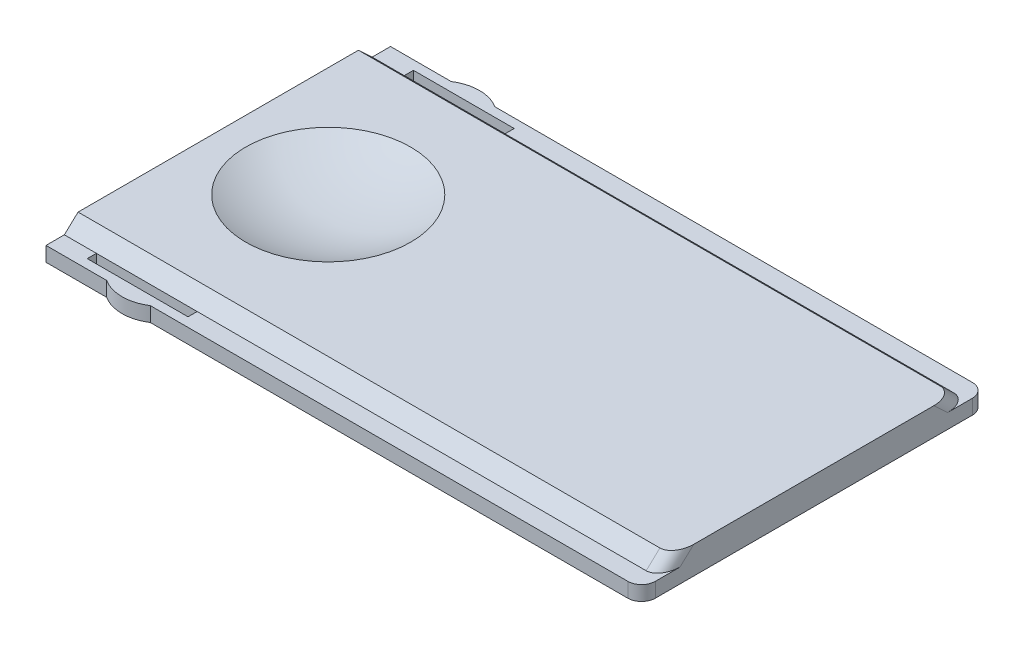
ISO-10303-21;
HEADER;
FILE_DESCRIPTION(('STEP AP214'),'2;1');
FILE_NAME('part.step','',(''),(''),'','','');
FILE_SCHEMA(('AUTOMOTIVE_DESIGN { 1 0 10303 214 1 1 1 1 }'));
ENDSEC;
DATA;
#1=APPLICATION_CONTEXT('core data for automotive mechanical design processes');
#2=APPLICATION_PROTOCOL_DEFINITION('international standard','automotive_design',2000,#1);
#3=PRODUCT_CONTEXT('',#1,'mechanical');
#4=PRODUCT('Part','Part','',(#3));
#5=PRODUCT_RELATED_PRODUCT_CATEGORY('part','',(#4));
#6=PRODUCT_DEFINITION_FORMATION('','',#4);
#7=PRODUCT_DEFINITION_CONTEXT('part definition',#1,'design');
#8=PRODUCT_DEFINITION('design','',#6,#7);
#9=PRODUCT_DEFINITION_SHAPE('','',#8);
#10=(LENGTH_UNIT() NAMED_UNIT(*) SI_UNIT(.MILLI.,.METRE.));
#11=(NAMED_UNIT(*) PLANE_ANGLE_UNIT() SI_UNIT($,.RADIAN.));
#12=(NAMED_UNIT(*) SI_UNIT($,.STERADIAN.) SOLID_ANGLE_UNIT());
#13=UNCERTAINTY_MEASURE_WITH_UNIT(LENGTH_MEASURE(1.E-05),#10,'distance_accuracy_value','');
#14=(GEOMETRIC_REPRESENTATION_CONTEXT(3) GLOBAL_UNCERTAINTY_ASSIGNED_CONTEXT((#13)) GLOBAL_UNIT_ASSIGNED_CONTEXT((#10,
#11,#12)) REPRESENTATION_CONTEXT('',''));
#15=CARTESIAN_POINT('',(0.,0.,0.));
#16=DIRECTION('',(0.,0.,1.));
#17=DIRECTION('',(1.,0.,0.));
#18=AXIS2_PLACEMENT_3D('',#15,#16,#17);
#19=CARTESIAN_POINT('',(65.,0.,18.8));
#20=DIRECTION('',(0.,0.,-1.));
#21=DIRECTION('',(-1.,0.,0.));
#22=AXIS2_PLACEMENT_3D('',#19,#20,#21);
#23=PLANE('',#22);
#24=DIRECTION('',(-1.,0.,0.));
#25=VECTOR('',#24,1.);
#26=CARTESIAN_POINT('',(65.,0.,18.8));
#27=LINE('',#26,#25);
#28=CARTESIAN_POINT('',(6.61882382004187,0.,18.8));
#29=VERTEX_POINT('',#28);
#30=CARTESIAN_POINT('',(0.,0.,18.8));
#31=VERTEX_POINT('',#30);
#32=EDGE_CURVE('E350',#29,#31,#27,.T.);
#33=ORIENTED_EDGE('',*,*,#32,.F.);
#34=DIRECTION('',(0.,1.,0.));
#35=VECTOR('',#34,1.);
#36=CARTESIAN_POINT('',(6.61882382004188,-12.4450793488832,18.8));
#37=LINE('',#36,#35);
#38=CARTESIAN_POINT('',(6.61882382004187,1.59999999999999,18.8));
#39=VERTEX_POINT('',#38);
#40=EDGE_CURVE('E281',#29,#39,#37,.T.);
#41=ORIENTED_EDGE('',*,*,#40,.T.);
#42=DIRECTION('',(-1.,0.,0.));
#43=VECTOR('',#42,1.);
#44=CARTESIAN_POINT('',(65.,1.6,18.8));
#45=LINE('',#44,#43);
#46=CARTESIAN_POINT('',(0.,1.6,18.8));
#47=VERTEX_POINT('',#46);
#48=EDGE_CURVE('E309',#39,#47,#45,.T.);
#49=ORIENTED_EDGE('',*,*,#48,.T.);
#50=DIRECTION('',(0.,-1.,0.));
#51=VECTOR('',#50,1.);
#52=CARTESIAN_POINT('',(0.,0.,18.8));
#53=LINE('',#52,#51);
#54=EDGE_CURVE('E296',#47,#31,#53,.T.);
#55=ORIENTED_EDGE('',*,*,#54,.T.);
#56=EDGE_LOOP('',(#33,#41,#49,#55));
#57=FACE_BOUND('',#56,.T.);
#58=ADVANCED_FACE('F33',(#57),#23,.F.);
#59=CARTESIAN_POINT('',(65.,0.,-18.8));
#60=DIRECTION('',(0.,0.,1.));
#61=DIRECTION('',(1.,0.,0.));
#62=AXIS2_PLACEMENT_3D('',#59,#60,#61);
#63=PLANE('',#62);
#64=DIRECTION('',(-1.,0.,0.));
#65=VECTOR('',#64,1.);
#66=CARTESIAN_POINT('',(65.,1.6,-18.8));
#67=LINE('',#66,#65);
#68=CARTESIAN_POINT('',(63.5,1.6,-18.8));
#69=VERTEX_POINT('',#68);
#70=CARTESIAN_POINT('',(11.3811761799581,1.6,-18.8));
#71=VERTEX_POINT('',#70);
#72=EDGE_CURVE('E345',#69,#71,#67,.T.);
#73=ORIENTED_EDGE('',*,*,#72,.F.);
#74=DIRECTION('',(0.,1.,0.));
#75=VECTOR('',#74,1.);
#76=CARTESIAN_POINT('',(63.5,0.,-18.8));
#77=LINE('',#76,#75);
#78=CARTESIAN_POINT('',(63.5,0.,-18.8));
#79=VERTEX_POINT('',#78);
#80=EDGE_CURVE('E383',#69,#79,#77,.F.);
#81=ORIENTED_EDGE('',*,*,#80,.T.);
#82=DIRECTION('',(-1.,0.,0.));
#83=VECTOR('',#82,1.);
#84=CARTESIAN_POINT('',(65.,0.,-18.8));
#85=LINE('',#84,#83);
#86=CARTESIAN_POINT('',(11.3811761799581,0.,-18.8));
#87=VERTEX_POINT('',#86);
#88=EDGE_CURVE('E348',#79,#87,#85,.T.);
#89=ORIENTED_EDGE('',*,*,#88,.T.);
#90=DIRECTION('',(0.,1.,0.));
#91=VECTOR('',#90,1.);
#92=CARTESIAN_POINT('',(11.3811761799581,-12.4450793488832,-18.8));
#93=LINE('',#92,#91);
#94=EDGE_CURVE('E293',#87,#71,#93,.T.);
#95=ORIENTED_EDGE('',*,*,#94,.T.);
#96=EDGE_LOOP('',(#73,#81,#89,#95));
#97=FACE_BOUND('',#96,.T.);
#98=ADVANCED_FACE('F436',(#97),#63,.F.);
#99=CARTESIAN_POINT('',(63.5,0.,18.8));
#100=VERTEX_POINT('',#99);
#101=CARTESIAN_POINT('',(11.3811761799581,0.,18.8));
#102=VERTEX_POINT('',#101);
#103=EDGE_CURVE('E351',#100,#102,#27,.T.);
#104=ORIENTED_EDGE('',*,*,#103,.F.);
#105=DIRECTION('',(0.,-1.,0.));
#106=VECTOR('',#105,1.);
#107=CARTESIAN_POINT('',(63.5,0.,18.8));
#108=LINE('',#107,#106);
#109=CARTESIAN_POINT('',(63.5,1.6,18.8));
#110=VERTEX_POINT('',#109);
#111=EDGE_CURVE('E371',#100,#110,#108,.F.);
#112=ORIENTED_EDGE('',*,*,#111,.T.);
#113=CARTESIAN_POINT('',(11.3811761799581,1.59999999999999,18.8));
#114=VERTEX_POINT('',#113);
#115=EDGE_CURVE('E332',#110,#114,#45,.T.);
#116=ORIENTED_EDGE('',*,*,#115,.T.);
#117=DIRECTION('',(0.,1.,0.));
#118=VECTOR('',#117,1.);
#119=CARTESIAN_POINT('',(11.3811761799581,-12.4450793488832,18.8));
#120=LINE('',#119,#118);
#121=EDGE_CURVE('E278',#114,#102,#120,.F.);
#122=ORIENTED_EDGE('',*,*,#121,.T.);
#123=EDGE_LOOP('',(#104,#112,#116,#122));
#124=FACE_BOUND('',#123,.T.);
#125=ADVANCED_FACE('F439',(#124),#23,.F.);
#126=CARTESIAN_POINT('',(65.,0.,-18.8));
#127=DIRECTION('',(0.,1.,0.));
#128=DIRECTION('',(0.,0.,1.));
#129=AXIS2_PLACEMENT_3D('',#126,#127,#128);
#130=PLANE('',#129);
#131=DIRECTION('',(-1.,0.,0.));
#132=VECTOR('',#131,1.);
#133=CARTESIAN_POINT('',(3.49999999999999,0.,16.8));
#134=LINE('',#133,#132);
#135=CARTESIAN_POINT('',(14.5,0.,16.8));
#136=VERTEX_POINT('',#135);
#137=CARTESIAN_POINT('',(3.49999999999999,0.,16.8));
#138=VERTEX_POINT('',#137);
#139=EDGE_CURVE('E207',#136,#138,#134,.T.);
#140=ORIENTED_EDGE('',*,*,#139,.T.);
#141=DIRECTION('',(0.,0.,1.));
#142=VECTOR('',#141,1.);
#143=CARTESIAN_POINT('',(3.49999999999999,0.,17.8));
#144=LINE('',#143,#142);
#145=CARTESIAN_POINT('',(3.49999999999999,0.,17.8));
#146=VERTEX_POINT('',#145);
#147=EDGE_CURVE('E199',#138,#146,#144,.T.);
#148=ORIENTED_EDGE('',*,*,#147,.T.);
#149=DIRECTION('',(1.,0.,0.));
#150=VECTOR('',#149,1.);
#151=CARTESIAN_POINT('',(3.49999999999999,0.,17.8));
#152=LINE('',#151,#150);
#153=CARTESIAN_POINT('',(14.5,0.,17.8));
#154=VERTEX_POINT('',#153);
#155=EDGE_CURVE('E211',#146,#154,#152,.T.);
#156=ORIENTED_EDGE('',*,*,#155,.T.);
#157=DIRECTION('',(0.,0.,-1.));
#158=VECTOR('',#157,1.);
#159=CARTESIAN_POINT('',(14.5,0.,17.8));
#160=LINE('',#159,#158);
#161=EDGE_CURVE('E215',#154,#136,#160,.T.);
#162=ORIENTED_EDGE('',*,*,#161,.T.);
#163=EDGE_LOOP('',(#140,#148,#156,#162));
#164=FACE_BOUND('',#163,.T.);
#165=DIRECTION('',(1.,0.,0.));
#166=VECTOR('',#165,1.);
#167=CARTESIAN_POINT('',(3.49999999999999,0.,-16.8));
#168=LINE('',#167,#166);
#169=CARTESIAN_POINT('',(3.49999999999999,0.,-16.8));
#170=VERTEX_POINT('',#169);
#171=CARTESIAN_POINT('',(14.5,0.,-16.8));
#172=VERTEX_POINT('',#171);
#173=EDGE_CURVE('E251',#170,#172,#168,.T.);
#174=ORIENTED_EDGE('',*,*,#173,.T.);
#175=DIRECTION('',(0.,0.,-1.));
#176=VECTOR('',#175,1.);
#177=CARTESIAN_POINT('',(14.5,0.,-17.8));
#178=LINE('',#177,#176);
#179=CARTESIAN_POINT('',(14.5,0.,-17.8));
#180=VERTEX_POINT('',#179);
#181=EDGE_CURVE('E241',#172,#180,#178,.T.);
#182=ORIENTED_EDGE('',*,*,#181,.T.);
#183=DIRECTION('',(-1.,0.,0.));
#184=VECTOR('',#183,1.);
#185=CARTESIAN_POINT('',(3.49999999999999,0.,-17.8));
#186=LINE('',#185,#184);
#187=CARTESIAN_POINT('',(3.5,0.,-17.8));
#188=VERTEX_POINT('',#187);
#189=EDGE_CURVE('E244',#180,#188,#186,.T.);
#190=ORIENTED_EDGE('',*,*,#189,.T.);
#191=DIRECTION('',(0.,0.,1.));
#192=VECTOR('',#191,1.);
#193=CARTESIAN_POINT('',(3.49999999999999,0.,-17.8));
#194=LINE('',#193,#192);
#195=EDGE_CURVE('E248',#188,#170,#194,.T.);
#196=ORIENTED_EDGE('',*,*,#195,.T.);
#197=EDGE_LOOP('',(#174,#182,#190,#196));
#198=FACE_BOUND('',#197,.T.);
#199=DIRECTION('',(0.,0.,-1.));
#200=VECTOR('',#199,1.);
#201=CARTESIAN_POINT('',(65.,0.,-18.8));
#202=LINE('',#201,#200);
#203=CARTESIAN_POINT('',(65.,0.,17.3));
#204=VERTEX_POINT('',#203);
#205=CARTESIAN_POINT('',(65.,0.,-17.3));
#206=VERTEX_POINT('',#205);
#207=EDGE_CURVE('E297',#204,#206,#202,.T.);
#208=ORIENTED_EDGE('',*,*,#207,.F.);
#209=CARTESIAN_POINT('',(63.5,0.,17.3));
#210=DIRECTION('',(0.,1.,0.));
#211=DIRECTION('',(0.,0.,1.));
#212=AXIS2_PLACEMENT_3D('',#209,#210,#211);
#213=CIRCLE('',#212,1.5);
#214=EDGE_CURVE('E369',#204,#100,#213,.F.);
#215=ORIENTED_EDGE('',*,*,#214,.T.);
#216=ORIENTED_EDGE('',*,*,#103,.T.);
#217=CARTESIAN_POINT('',(9.,0.,15.1));
#218=DIRECTION('',(0.,1.,0.));
#219=DIRECTION('',(0.,0.,1.));
#220=AXIS2_PLACEMENT_3D('',#217,#218,#219);
#221=CIRCLE('',#220,4.4);
#222=EDGE_CURVE('E276',#102,#29,#221,.F.);
#223=ORIENTED_EDGE('',*,*,#222,.T.);
#224=ORIENTED_EDGE('',*,*,#32,.T.);
#225=DIRECTION('',(0.,0.,-1.));
#226=VECTOR('',#225,1.);
#227=CARTESIAN_POINT('',(0.,0.,-18.8));
#228=LINE('',#227,#226);
#229=CARTESIAN_POINT('',(0.,0.,-18.8));
#230=VERTEX_POINT('',#229);
#231=EDGE_CURVE('E312',#31,#230,#228,.T.);
#232=ORIENTED_EDGE('',*,*,#231,.T.);
#233=CARTESIAN_POINT('',(6.61882382004187,0.,-18.8));
#234=VERTEX_POINT('',#233);
#235=EDGE_CURVE('E347',#234,#230,#85,.T.);
#236=ORIENTED_EDGE('',*,*,#235,.F.);
#237=CARTESIAN_POINT('',(9.,0.,-15.1));
#238=DIRECTION('',(0.,1.,0.));
#239=DIRECTION('',(0.,0.,1.));
#240=AXIS2_PLACEMENT_3D('',#237,#238,#239);
#241=CIRCLE('',#240,4.4);
#242=EDGE_CURVE('E287',#234,#87,#241,.F.);
#243=ORIENTED_EDGE('',*,*,#242,.T.);
#244=ORIENTED_EDGE('',*,*,#88,.F.);
#245=CARTESIAN_POINT('',(63.5,0.,-17.3));
#246=DIRECTION('',(0.,1.,0.));
#247=DIRECTION('',(0.,0.,1.));
#248=AXIS2_PLACEMENT_3D('',#245,#246,#247);
#249=CIRCLE('',#248,1.5);
#250=EDGE_CURVE('E367',#79,#206,#249,.F.);
#251=ORIENTED_EDGE('',*,*,#250,.T.);
#252=EDGE_LOOP('',(#208,#215,#216,#223,#224,#232,#236,#243,#244,#251));
#253=FACE_BOUND('',#252,.T.);
#254=ADVANCED_FACE('F217',(#164,#198,#253),#130,.F.);
#255=CARTESIAN_POINT('',(6.61882382004187,1.6,-18.8));
#256=VERTEX_POINT('',#255);
#257=CARTESIAN_POINT('',(0.,1.6,-18.8));
#258=VERTEX_POINT('',#257);
#259=EDGE_CURVE('E344',#256,#258,#67,.T.);
#260=ORIENTED_EDGE('',*,*,#259,.F.);
#261=DIRECTION('',(0.,1.,0.));
#262=VECTOR('',#261,1.);
#263=CARTESIAN_POINT('',(6.61882382004187,-12.4450793488832,-18.8));
#264=LINE('',#263,#262);
#265=EDGE_CURVE('E290',#256,#234,#264,.F.);
#266=ORIENTED_EDGE('',*,*,#265,.T.);
#267=ORIENTED_EDGE('',*,*,#235,.T.);
#268=DIRECTION('',(0.,1.,0.));
#269=VECTOR('',#268,1.);
#270=CARTESIAN_POINT('',(0.,0.,-18.8));
#271=LINE('',#270,#269);
#272=EDGE_CURVE('E315',#230,#258,#271,.T.);
#273=ORIENTED_EDGE('',*,*,#272,.T.);
#274=EDGE_LOOP('',(#260,#266,#267,#273));
#275=FACE_BOUND('',#274,.T.);
#276=ADVANCED_FACE('F445',(#275),#63,.F.);
#277=CARTESIAN_POINT('',(65.,1.6,-18.8));
#278=DIRECTION('',(0.,-1.,0.));
#279=DIRECTION('',(0.,0.,-1.));
#280=AXIS2_PLACEMENT_3D('',#277,#278,#279);
#281=PLANE('',#280);
#282=DIRECTION('',(0.,0.,1.));
#283=VECTOR('',#282,1.);
#284=CARTESIAN_POINT('',(65.,1.6,-18.8));
#285=LINE('',#284,#283);
#286=CARTESIAN_POINT('',(65.,1.6,-17.3));
#287=VERTEX_POINT('',#286);
#288=CARTESIAN_POINT('',(65.,1.6,-14.6016123719268));
#289=VERTEX_POINT('',#288);
#290=EDGE_CURVE('E300',#287,#289,#285,.T.);
#291=ORIENTED_EDGE('',*,*,#290,.F.);
#292=CARTESIAN_POINT('',(63.5,1.6,-17.3));
#293=DIRECTION('',(0.,-1.,0.));
#294=DIRECTION('',(0.,0.,-1.));
#295=AXIS2_PLACEMENT_3D('',#292,#293,#294);
#296=CIRCLE('',#295,1.5);
#297=EDGE_CURVE('E48',#287,#69,#296,.F.);
#298=ORIENTED_EDGE('',*,*,#297,.T.);
#299=ORIENTED_EDGE('',*,*,#72,.T.);
#300=CARTESIAN_POINT('',(9.,1.6,-15.1));
#301=DIRECTION('',(0.,1.,0.));
#302=DIRECTION('',(0.,0.,1.));
#303=AXIS2_PLACEMENT_3D('',#300,#301,#302);
#304=CIRCLE('',#303,4.4);
#305=EDGE_CURVE('E284',#71,#256,#304,.T.);
#306=ORIENTED_EDGE('',*,*,#305,.T.);
#307=ORIENTED_EDGE('',*,*,#259,.T.);
#308=DIRECTION('',(0.,0.,1.));
#309=VECTOR('',#308,1.);
#310=CARTESIAN_POINT('',(0.,1.6,-18.8));
#311=LINE('',#310,#309);
#312=CARTESIAN_POINT('',(0.,1.6,-16.8));
#313=VERTEX_POINT('',#312);
#314=EDGE_CURVE('E318',#258,#313,#311,.T.);
#315=ORIENTED_EDGE('',*,*,#314,.T.);
#316=DIRECTION('',(-1.,0.,0.));
#317=VECTOR('',#316,1.);
#318=CARTESIAN_POINT('',(65.,1.6,-16.8));
#319=LINE('',#318,#317);
#320=CARTESIAN_POINT('',(3.5,1.6,-16.8));
#321=VERTEX_POINT('',#320);
#322=EDGE_CURVE('E341',#321,#313,#319,.T.);
#323=ORIENTED_EDGE('',*,*,#322,.F.);
#324=DIRECTION('',(0.,0.,1.));
#325=VECTOR('',#324,1.);
#326=CARTESIAN_POINT('',(3.49999999999999,1.6,-17.8));
#327=LINE('',#326,#325);
#328=CARTESIAN_POINT('',(3.49999999999999,1.6,-17.8));
#329=VERTEX_POINT('',#328);
#330=EDGE_CURVE('E260',#329,#321,#327,.T.);
#331=ORIENTED_EDGE('',*,*,#330,.F.);
#332=DIRECTION('',(-1.,0.,0.));
#333=VECTOR('',#332,1.);
#334=CARTESIAN_POINT('',(3.49999999999999,1.6,-17.8));
#335=LINE('',#334,#333);
#336=CARTESIAN_POINT('',(14.5,1.6,-17.8));
#337=VERTEX_POINT('',#336);
#338=EDGE_CURVE('E257',#337,#329,#335,.T.);
#339=ORIENTED_EDGE('',*,*,#338,.F.);
#340=DIRECTION('',(0.,0.,-1.));
#341=VECTOR('',#340,1.);
#342=CARTESIAN_POINT('',(14.5,1.6,-17.8));
#343=LINE('',#342,#341);
#344=CARTESIAN_POINT('',(14.5,1.6,-16.8));
#345=VERTEX_POINT('',#344);
#346=EDGE_CURVE('E236',#345,#337,#343,.T.);
#347=ORIENTED_EDGE('',*,*,#346,.F.);
#348=CARTESIAN_POINT('',(63.5,1.6,-16.8));
#349=VERTEX_POINT('',#348);
#350=EDGE_CURVE('E342',#349,#345,#319,.T.);
#351=ORIENTED_EDGE('',*,*,#350,.F.);
#352=CARTESIAN_POINT('',(63.5,1.6,-14.6016123719268));
#353=DIRECTION('',(0.,-1.,0.));
#354=DIRECTION('',(0.,0.,1.));
#355=AXIS2_PLACEMENT_3D('',#352,#353,#354);
#356=ELLIPSE('',#355,2.1983876280732,1.5);
#357=EDGE_CURVE('E11',#349,#289,#356,.T.);
#358=ORIENTED_EDGE('',*,*,#357,.T.);
#359=EDGE_LOOP('',(#291,#298,#299,#306,#307,#315,#323,#331,#339,#347,#351,#358));
#360=FACE_BOUND('',#359,.T.);
#361=ADVANCED_FACE('F469',(#360),#281,.F.);
#362=CARTESIAN_POINT('',(65.,1.6,-16.8));
#363=DIRECTION('',(0.,-0.731055268242869,0.682318250360011));
#364=DIRECTION('',(0.,-0.682318250360011,-0.731055268242869));
#365=AXIS2_PLACEMENT_3D('',#362,#363,#364);
#366=PLANE('',#365);
#367=DIRECTION('',(-1.,0.,0.));
#368=VECTOR('',#367,1.);
#369=CARTESIAN_POINT('',(65.,3.,-15.3));
#370=LINE('',#369,#368);
#371=CARTESIAN_POINT('',(63.5,3.,-15.3));
#372=VERTEX_POINT('',#371);
#373=CARTESIAN_POINT('',(0.,3.,-15.3));
#374=VERTEX_POINT('',#373);
#375=EDGE_CURVE('E339',#372,#374,#370,.T.);
#376=ORIENTED_EDGE('',*,*,#375,.F.);
#377=DIRECTION('',(0.,0.682318250360011,0.731055268242869));
#378=VECTOR('',#377,1.);
#379=CARTESIAN_POINT('',(63.5,1.6,-16.8));
#380=LINE('',#379,#378);
#381=EDGE_CURVE('E56',#372,#349,#380,.F.);
#382=ORIENTED_EDGE('',*,*,#381,.T.);
#383=ORIENTED_EDGE('',*,*,#350,.T.);
#384=DIRECTION('',(1.,0.,0.));
#385=VECTOR('',#384,1.);
#386=CARTESIAN_POINT('',(3.49999999999999,1.6,-16.8));
#387=LINE('',#386,#385);
#388=EDGE_CURVE('E245',#321,#345,#387,.T.);
#389=ORIENTED_EDGE('',*,*,#388,.F.);
#390=ORIENTED_EDGE('',*,*,#322,.T.);
#391=DIRECTION('',(0.,0.682318250360011,0.731055268242869));
#392=VECTOR('',#391,1.);
#393=CARTESIAN_POINT('',(0.,1.6,-16.8));
#394=LINE('',#393,#392);
#395=EDGE_CURVE('E321',#313,#374,#394,.T.);
#396=ORIENTED_EDGE('',*,*,#395,.T.);
#397=EDGE_LOOP('',(#376,#382,#383,#389,#390,#396));
#398=FACE_BOUND('',#397,.T.);
#399=ADVANCED_FACE('F409',(#398),#366,.F.);
#400=CARTESIAN_POINT('',(65.,3.,15.3));
#401=DIRECTION('',(0.,-1.,0.));
#402=DIRECTION('',(0.,0.,-1.));
#403=AXIS2_PLACEMENT_3D('',#400,#401,#402);
#404=PLANE('',#403);
#405=CARTESIAN_POINT('',(12.,3.,0.));
#406=DIRECTION('',(0.,-1.,0.));
#407=DIRECTION('',(0.,0.,-1.));
#408=AXIS2_PLACEMENT_3D('',#405,#406,#407);
#409=CIRCLE('',#408,9.);
#410=CARTESIAN_POINT('',(12.,3.,-9.));
#411=VERTEX_POINT('',#410);
#412=EDGE_CURVE('E230',#411,#411,#409,.T.);
#413=ORIENTED_EDGE('',*,*,#412,.T.);
#414=EDGE_LOOP('',(#413));
#415=FACE_BOUND('',#414,.T.);
#416=DIRECTION('',(-1.,0.,0.));
#417=VECTOR('',#416,1.);
#418=CARTESIAN_POINT('',(65.,3.,15.3));
#419=LINE('',#418,#417);
#420=CARTESIAN_POINT('',(63.5,3.,15.3));
#421=VERTEX_POINT('',#420);
#422=CARTESIAN_POINT('',(0.,3.,15.3));
#423=VERTEX_POINT('',#422);
#424=EDGE_CURVE('E337',#421,#423,#419,.T.);
#425=ORIENTED_EDGE('',*,*,#424,.F.);
#426=CARTESIAN_POINT('',(63.5,3.,13.1016123719268));
#427=DIRECTION('',(0.,-1.,0.));
#428=DIRECTION('',(0.,0.,1.));
#429=AXIS2_PLACEMENT_3D('',#426,#427,#428);
#430=ELLIPSE('',#429,2.1983876280732,1.5);
#431=CARTESIAN_POINT('',(65.,3.,13.1016123719268));
#432=VERTEX_POINT('',#431);
#433=EDGE_CURVE('E379',#421,#432,#430,.F.);
#434=ORIENTED_EDGE('',*,*,#433,.T.);
#435=DIRECTION('',(0.,0.,1.));
#436=VECTOR('',#435,1.);
#437=CARTESIAN_POINT('',(65.,3.,15.3));
#438=LINE('',#437,#436);
#439=CARTESIAN_POINT('',(65.,3.,-13.1016123719268));
#440=VERTEX_POINT('',#439);
#441=EDGE_CURVE('E303',#440,#432,#438,.T.);
#442=ORIENTED_EDGE('',*,*,#441,.F.);
#443=CARTESIAN_POINT('',(63.5,3.,-13.1016123719268));
#444=DIRECTION('',(0.,-1.,0.));
#445=DIRECTION('',(0.,0.,1.));
#446=AXIS2_PLACEMENT_3D('',#443,#444,#445);
#447=ELLIPSE('',#446,2.1983876280732,1.5);
#448=EDGE_CURVE('E377',#440,#372,#447,.F.);
#449=ORIENTED_EDGE('',*,*,#448,.T.);
#450=ORIENTED_EDGE('',*,*,#375,.T.);
#451=DIRECTION('',(0.,0.,1.));
#452=VECTOR('',#451,1.);
#453=CARTESIAN_POINT('',(0.,3.,15.3));
#454=LINE('',#453,#452);
#455=EDGE_CURVE('E324',#374,#423,#454,.T.);
#456=ORIENTED_EDGE('',*,*,#455,.T.);
#457=EDGE_LOOP('',(#425,#434,#442,#449,#450,#456));
#458=FACE_BOUND('',#457,.T.);
#459=ADVANCED_FACE('F402',(#415,#458),#404,.F.);
#460=CARTESIAN_POINT('',(65.,1.6,16.8));
#461=DIRECTION('',(0.,-0.731055268242869,-0.682318250360011));
#462=DIRECTION('',(0.,0.682318250360011,-0.731055268242869));
#463=AXIS2_PLACEMENT_3D('',#460,#461,#462);
#464=PLANE('',#463);
#465=DIRECTION('',(-1.,0.,0.));
#466=VECTOR('',#465,1.);
#467=CARTESIAN_POINT('',(65.,1.6,16.8));
#468=LINE('',#467,#466);
#469=CARTESIAN_POINT('',(63.5,1.6,16.8));
#470=VERTEX_POINT('',#469);
#471=CARTESIAN_POINT('',(14.5,1.59999999999999,16.8));
#472=VERTEX_POINT('',#471);
#473=EDGE_CURVE('E335',#470,#472,#468,.T.);
#474=ORIENTED_EDGE('',*,*,#473,.F.);
#475=DIRECTION('',(0.,-0.682318250360011,0.731055268242869));
#476=VECTOR('',#475,1.);
#477=CARTESIAN_POINT('',(63.5,1.6,16.8));
#478=LINE('',#477,#476);
#479=EDGE_CURVE('E375',#470,#421,#478,.F.);
#480=ORIENTED_EDGE('',*,*,#479,.T.);
#481=ORIENTED_EDGE('',*,*,#424,.T.);
#482=DIRECTION('',(0.,-0.682318250360011,0.731055268242869));
#483=VECTOR('',#482,1.);
#484=CARTESIAN_POINT('',(0.,1.6,16.8));
#485=LINE('',#484,#483);
#486=CARTESIAN_POINT('',(0.,1.6,16.8));
#487=VERTEX_POINT('',#486);
#488=EDGE_CURVE('E327',#423,#487,#485,.T.);
#489=ORIENTED_EDGE('',*,*,#488,.T.);
#490=CARTESIAN_POINT('',(3.49999999999999,1.59999999999999,16.8));
#491=VERTEX_POINT('',#490);
#492=EDGE_CURVE('E334',#491,#487,#468,.T.);
#493=ORIENTED_EDGE('',*,*,#492,.F.);
#494=DIRECTION('',(-1.,0.,0.));
#495=VECTOR('',#494,1.);
#496=CARTESIAN_POINT('',(3.49999999999999,1.59999999999999,16.8));
#497=LINE('',#496,#495);
#498=EDGE_CURVE('E220',#472,#491,#497,.T.);
#499=ORIENTED_EDGE('',*,*,#498,.F.);
#500=EDGE_LOOP('',(#474,#480,#481,#489,#493,#499));
#501=FACE_BOUND('',#500,.T.);
#502=ADVANCED_FACE('F395',(#501),#464,.F.);
#503=CARTESIAN_POINT('',(65.,1.6,18.8));
#504=DIRECTION('',(0.,-1.,0.));
#505=DIRECTION('',(0.,0.,-1.));
#506=AXIS2_PLACEMENT_3D('',#503,#504,#505);
#507=PLANE('',#506);
#508=ORIENTED_EDGE('',*,*,#115,.F.);
#509=CARTESIAN_POINT('',(63.5,1.6,17.3));
#510=DIRECTION('',(0.,-1.,0.));
#511=DIRECTION('',(0.,0.,-1.));
#512=AXIS2_PLACEMENT_3D('',#509,#510,#511);
#513=CIRCLE('',#512,1.5);
#514=CARTESIAN_POINT('',(65.,1.6,17.3));
#515=VERTEX_POINT('',#514);
#516=EDGE_CURVE('E373',#110,#515,#513,.F.);
#517=ORIENTED_EDGE('',*,*,#516,.T.);
#518=DIRECTION('',(0.,0.,1.));
#519=VECTOR('',#518,1.);
#520=CARTESIAN_POINT('',(65.,1.6,18.8));
#521=LINE('',#520,#519);
#522=CARTESIAN_POINT('',(65.,1.6,14.6016123719268));
#523=VERTEX_POINT('',#522);
#524=EDGE_CURVE('E306',#523,#515,#521,.T.);
#525=ORIENTED_EDGE('',*,*,#524,.F.);
#526=CARTESIAN_POINT('',(63.5,1.6,14.6016123719268));
#527=DIRECTION('',(0.,-1.,0.));
#528=DIRECTION('',(0.,0.,1.));
#529=AXIS2_PLACEMENT_3D('',#526,#527,#528);
#530=ELLIPSE('',#529,2.1983876280732,1.5);
#531=EDGE_CURVE('E41',#523,#470,#530,.T.);
#532=ORIENTED_EDGE('',*,*,#531,.T.);
#533=ORIENTED_EDGE('',*,*,#473,.T.);
#534=DIRECTION('',(0.,0.,-1.));
#535=VECTOR('',#534,1.);
#536=CARTESIAN_POINT('',(14.5,1.59999999999999,17.8));
#537=LINE('',#536,#535);
#538=CARTESIAN_POINT('',(14.5,1.59999999999999,17.8));
#539=VERTEX_POINT('',#538);
#540=EDGE_CURVE('E223',#539,#472,#537,.T.);
#541=ORIENTED_EDGE('',*,*,#540,.F.);
#542=DIRECTION('',(1.,0.,0.));
#543=VECTOR('',#542,1.);
#544=CARTESIAN_POINT('',(3.49999999999999,1.59999999999999,17.8));
#545=LINE('',#544,#543);
#546=CARTESIAN_POINT('',(3.5,1.6,17.8));
#547=VERTEX_POINT('',#546);
#548=EDGE_CURVE('E229',#547,#539,#545,.T.);
#549=ORIENTED_EDGE('',*,*,#548,.F.);
#550=DIRECTION('',(0.,0.,1.));
#551=VECTOR('',#550,1.);
#552=CARTESIAN_POINT('',(3.49999999999999,1.59999999999999,17.8));
#553=LINE('',#552,#551);
#554=EDGE_CURVE('E202',#491,#547,#553,.T.);
#555=ORIENTED_EDGE('',*,*,#554,.F.);
#556=ORIENTED_EDGE('',*,*,#492,.T.);
#557=DIRECTION('',(0.,0.,1.));
#558=VECTOR('',#557,1.);
#559=CARTESIAN_POINT('',(0.,1.6,18.8));
#560=LINE('',#559,#558);
#561=EDGE_CURVE('E301',#487,#47,#560,.T.);
#562=ORIENTED_EDGE('',*,*,#561,.T.);
#563=ORIENTED_EDGE('',*,*,#48,.F.);
#564=CARTESIAN_POINT('',(9.,1.59999999999999,15.1));
#565=DIRECTION('',(0.,1.,0.));
#566=DIRECTION('',(0.,0.,-1.));
#567=AXIS2_PLACEMENT_3D('',#564,#565,#566);
#568=CIRCLE('',#567,4.4);
#569=EDGE_CURVE('E267',#39,#114,#568,.T.);
#570=ORIENTED_EDGE('',*,*,#569,.T.);
#571=EDGE_LOOP('',(#508,#517,#525,#532,#533,#541,#549,#555,#556,#562,#563,#570));
#572=FACE_BOUND('',#571,.T.);
#573=ADVANCED_FACE('F388',(#572),#507,.F.);
#574=CARTESIAN_POINT('',(65.,0.,0.));
#575=DIRECTION('',(-1.,0.,0.));
#576=DIRECTION('',(0.,0.,1.));
#577=AXIS2_PLACEMENT_3D('',#574,#575,#576);
#578=PLANE('',#577);
#579=ORIENTED_EDGE('',*,*,#524,.T.);
#580=DIRECTION('',(0.,-1.,0.));
#581=VECTOR('',#580,1.);
#582=CARTESIAN_POINT('',(65.,0.,17.3));
#583=LINE('',#582,#581);
#584=EDGE_CURVE('E364',#515,#204,#583,.T.);
#585=ORIENTED_EDGE('',*,*,#584,.T.);
#586=ORIENTED_EDGE('',*,*,#207,.T.);
#587=DIRECTION('',(0.,1.,0.));
#588=VECTOR('',#587,1.);
#589=CARTESIAN_POINT('',(65.,0.,-17.3));
#590=LINE('',#589,#588);
#591=EDGE_CURVE('E353',#206,#287,#590,.T.);
#592=ORIENTED_EDGE('',*,*,#591,.T.);
#593=ORIENTED_EDGE('',*,*,#290,.T.);
#594=DIRECTION('',(0.,0.682318250360011,0.731055268242869));
#595=VECTOR('',#594,1.);
#596=CARTESIAN_POINT('',(65.,8.13857149193498,-7.59600005913932));
#597=LINE('',#596,#595);
#598=EDGE_CURVE('E358',#289,#440,#597,.T.);
#599=ORIENTED_EDGE('',*,*,#598,.T.);
#600=ORIENTED_EDGE('',*,*,#441,.T.);
#601=DIRECTION('',(0.,-0.682318250360011,0.731055268242869));
#602=VECTOR('',#601,1.);
#603=CARTESIAN_POINT('',(65.,8.13857149193498,7.59600005913932));
#604=LINE('',#603,#602);
#605=EDGE_CURVE('E361',#432,#523,#604,.T.);
#606=ORIENTED_EDGE('',*,*,#605,.T.);
#607=EDGE_LOOP('',(#579,#585,#586,#592,#593,#599,#600,#606));
#608=FACE_BOUND('',#607,.T.);
#609=ADVANCED_FACE('F404',(#608),#578,.F.);
#610=CARTESIAN_POINT('',(0.,0.,0.));
#611=DIRECTION('',(-1.,0.,0.));
#612=DIRECTION('',(0.,0.,1.));
#613=AXIS2_PLACEMENT_3D('',#610,#611,#612);
#614=PLANE('',#613);
#615=ORIENTED_EDGE('',*,*,#54,.F.);
#616=ORIENTED_EDGE('',*,*,#561,.F.);
#617=ORIENTED_EDGE('',*,*,#488,.F.);
#618=ORIENTED_EDGE('',*,*,#455,.F.);
#619=ORIENTED_EDGE('',*,*,#395,.F.);
#620=ORIENTED_EDGE('',*,*,#314,.F.);
#621=ORIENTED_EDGE('',*,*,#272,.F.);
#622=ORIENTED_EDGE('',*,*,#231,.F.);
#623=EDGE_LOOP('',(#615,#616,#617,#618,#619,#620,#621,#622));
#624=FACE_BOUND('',#623,.T.);
#625=ADVANCED_FACE('F418',(#624),#614,.T.);
#626=CARTESIAN_POINT('',(9.,-12.4450793488832,-15.1));
#627=DIRECTION('',(0.,1.,0.));
#628=DIRECTION('',(0.,0.,1.));
#629=AXIS2_PLACEMENT_3D('',#626,#627,#628);
#630=CYLINDRICAL_SURFACE('',#629,4.4);
#631=ORIENTED_EDGE('',*,*,#94,.F.);
#632=ORIENTED_EDGE('',*,*,#242,.F.);
#633=ORIENTED_EDGE('',*,*,#265,.F.);
#634=ORIENTED_EDGE('',*,*,#305,.F.);
#635=EDGE_LOOP('',(#631,#632,#633,#634));
#636=FACE_BOUND('',#635,.T.);
#637=ADVANCED_FACE('F489',(#636),#630,.T.);
#638=CARTESIAN_POINT('',(9.,-12.4450793488832,15.1));
#639=DIRECTION('',(0.,1.,0.));
#640=DIRECTION('',(0.,0.,1.));
#641=AXIS2_PLACEMENT_3D('',#638,#639,#640);
#642=CYLINDRICAL_SURFACE('',#641,4.4);
#643=ORIENTED_EDGE('',*,*,#40,.F.);
#644=ORIENTED_EDGE('',*,*,#222,.F.);
#645=ORIENTED_EDGE('',*,*,#121,.F.);
#646=ORIENTED_EDGE('',*,*,#569,.F.);
#647=EDGE_LOOP('',(#643,#644,#645,#646));
#648=FACE_BOUND('',#647,.T.);
#649=ADVANCED_FACE('F487',(#648),#642,.T.);
#650=CARTESIAN_POINT('',(14.5,0.,-17.8));
#651=DIRECTION('',(1.,0.,0.));
#652=DIRECTION('',(0.,0.,-1.));
#653=AXIS2_PLACEMENT_3D('',#650,#651,#652);
#654=PLANE('',#653);
#655=ORIENTED_EDGE('',*,*,#346,.T.);
#656=DIRECTION('',(0.,1.,0.));
#657=VECTOR('',#656,1.);
#658=CARTESIAN_POINT('',(14.5,0.,-17.8));
#659=LINE('',#658,#657);
#660=EDGE_CURVE('E254',#180,#337,#659,.T.);
#661=ORIENTED_EDGE('',*,*,#660,.F.);
#662=ORIENTED_EDGE('',*,*,#181,.F.);
#663=DIRECTION('',(0.,1.,0.));
#664=VECTOR('',#663,1.);
#665=CARTESIAN_POINT('',(14.5,0.,-16.8));
#666=LINE('',#665,#664);
#667=EDGE_CURVE('E264',#172,#345,#666,.T.);
#668=ORIENTED_EDGE('',*,*,#667,.T.);
#669=EDGE_LOOP('',(#655,#661,#662,#668));
#670=FACE_BOUND('',#669,.T.);
#671=ADVANCED_FACE('F474',(#670),#654,.F.);
#672=CARTESIAN_POINT('',(3.49999999999999,0.,-16.8));
#673=DIRECTION('',(0.,0.,1.));
#674=DIRECTION('',(0.,-1.,0.));
#675=AXIS2_PLACEMENT_3D('',#672,#673,#674);
#676=PLANE('',#675);
#677=ORIENTED_EDGE('',*,*,#388,.T.);
#678=ORIENTED_EDGE('',*,*,#667,.F.);
#679=ORIENTED_EDGE('',*,*,#173,.F.);
#680=DIRECTION('',(0.,1.,0.));
#681=VECTOR('',#680,1.);
#682=CARTESIAN_POINT('',(3.49999999999999,0.,-16.8));
#683=LINE('',#682,#681);
#684=EDGE_CURVE('E268',#170,#321,#683,.T.);
#685=ORIENTED_EDGE('',*,*,#684,.T.);
#686=EDGE_LOOP('',(#677,#678,#679,#685));
#687=FACE_BOUND('',#686,.T.);
#688=ADVANCED_FACE('F477',(#687),#676,.F.);
#689=CARTESIAN_POINT('',(3.49999999999999,0.,-17.8));
#690=DIRECTION('',(-1.,0.,0.));
#691=DIRECTION('',(0.,0.,1.));
#692=AXIS2_PLACEMENT_3D('',#689,#690,#691);
#693=PLANE('',#692);
#694=ORIENTED_EDGE('',*,*,#330,.T.);
#695=ORIENTED_EDGE('',*,*,#684,.F.);
#696=ORIENTED_EDGE('',*,*,#195,.F.);
#697=DIRECTION('',(0.,1.,0.));
#698=VECTOR('',#697,1.);
#699=CARTESIAN_POINT('',(3.49999999999999,0.,-17.8));
#700=LINE('',#699,#698);
#701=EDGE_CURVE('E271',#188,#329,#700,.T.);
#702=ORIENTED_EDGE('',*,*,#701,.T.);
#703=EDGE_LOOP('',(#694,#695,#696,#702));
#704=FACE_BOUND('',#703,.T.);
#705=ADVANCED_FACE('F571',(#704),#693,.F.);
#706=CARTESIAN_POINT('',(3.49999999999999,0.,-17.8));
#707=DIRECTION('',(0.,0.,-1.));
#708=DIRECTION('',(0.,1.,0.));
#709=AXIS2_PLACEMENT_3D('',#706,#707,#708);
#710=PLANE('',#709);
#711=ORIENTED_EDGE('',*,*,#338,.T.);
#712=ORIENTED_EDGE('',*,*,#701,.F.);
#713=ORIENTED_EDGE('',*,*,#189,.F.);
#714=ORIENTED_EDGE('',*,*,#660,.T.);
#715=EDGE_LOOP('',(#711,#712,#713,#714));
#716=FACE_BOUND('',#715,.T.);
#717=ADVANCED_FACE('F432',(#716),#710,.F.);
#718=CARTESIAN_POINT('',(3.49999999999999,0.,17.8));
#719=DIRECTION('',(-1.,0.,0.));
#720=DIRECTION('',(0.,0.,1.));
#721=AXIS2_PLACEMENT_3D('',#718,#719,#720);
#722=PLANE('',#721);
#723=ORIENTED_EDGE('',*,*,#554,.T.);
#724=DIRECTION('',(0.,1.,0.));
#725=VECTOR('',#724,1.);
#726=CARTESIAN_POINT('',(3.49999999999999,0.,17.8));
#727=LINE('',#726,#725);
#728=EDGE_CURVE('E195',#146,#547,#727,.T.);
#729=ORIENTED_EDGE('',*,*,#728,.F.);
#730=ORIENTED_EDGE('',*,*,#147,.F.);
#731=DIRECTION('',(0.,1.,0.));
#732=VECTOR('',#731,1.);
#733=CARTESIAN_POINT('',(3.49999999999999,0.,16.8));
#734=LINE('',#733,#732);
#735=EDGE_CURVE('E234',#138,#491,#734,.T.);
#736=ORIENTED_EDGE('',*,*,#735,.T.);
#737=EDGE_LOOP('',(#723,#729,#730,#736));
#738=FACE_BOUND('',#737,.T.);
#739=ADVANCED_FACE('F197',(#738),#722,.F.);
#740=CARTESIAN_POINT('',(3.49999999999999,0.,16.8));
#741=DIRECTION('',(0.,0.,-1.));
#742=DIRECTION('',(0.,1.,0.));
#743=AXIS2_PLACEMENT_3D('',#740,#741,#742);
#744=PLANE('',#743);
#745=ORIENTED_EDGE('',*,*,#498,.T.);
#746=ORIENTED_EDGE('',*,*,#735,.F.);
#747=ORIENTED_EDGE('',*,*,#139,.F.);
#748=DIRECTION('',(0.,1.,0.));
#749=VECTOR('',#748,1.);
#750=CARTESIAN_POINT('',(14.5,0.,16.8));
#751=LINE('',#750,#749);
#752=EDGE_CURVE('E237',#136,#472,#751,.T.);
#753=ORIENTED_EDGE('',*,*,#752,.T.);
#754=EDGE_LOOP('',(#745,#746,#747,#753));
#755=FACE_BOUND('',#754,.T.);
#756=ADVANCED_FACE('F424',(#755),#744,.F.);
#757=CARTESIAN_POINT('',(14.5,0.,17.8));
#758=DIRECTION('',(1.,0.,0.));
#759=DIRECTION('',(0.,0.,-1.));
#760=AXIS2_PLACEMENT_3D('',#757,#758,#759);
#761=PLANE('',#760);
#762=ORIENTED_EDGE('',*,*,#540,.T.);
#763=ORIENTED_EDGE('',*,*,#752,.F.);
#764=ORIENTED_EDGE('',*,*,#161,.F.);
#765=DIRECTION('',(0.,1.,0.));
#766=VECTOR('',#765,1.);
#767=CARTESIAN_POINT('',(14.5,0.,17.8));
#768=LINE('',#767,#766);
#769=EDGE_CURVE('E206',#154,#539,#768,.T.);
#770=ORIENTED_EDGE('',*,*,#769,.T.);
#771=EDGE_LOOP('',(#762,#763,#764,#770));
#772=FACE_BOUND('',#771,.T.);
#773=ADVANCED_FACE('F422',(#772),#761,.F.);
#774=CARTESIAN_POINT('',(3.49999999999999,0.,17.8));
#775=DIRECTION('',(0.,0.,1.));
#776=DIRECTION('',(0.,-1.,0.));
#777=AXIS2_PLACEMENT_3D('',#774,#775,#776);
#778=PLANE('',#777);
#779=ORIENTED_EDGE('',*,*,#548,.T.);
#780=ORIENTED_EDGE('',*,*,#769,.F.);
#781=ORIENTED_EDGE('',*,*,#155,.F.);
#782=ORIENTED_EDGE('',*,*,#728,.T.);
#783=EDGE_LOOP('',(#779,#780,#781,#782));
#784=FACE_BOUND('',#783,.T.);
#785=ADVANCED_FACE('F212',(#784),#778,.F.);
#786=CARTESIAN_POINT('',(12.,20.3090909090909,0.));
#787=DIRECTION('',(0.,1.,0.));
#788=DIRECTION('',(1.,0.,0.));
#789=AXIS2_PLACEMENT_3D('',#786,#787,#788);
#790=SPHERICAL_SURFACE('',#789,19.5090909090909);
#791=ORIENTED_EDGE('',*,*,#412,.F.);
#792=EDGE_LOOP('',(#791));
#793=FACE_BOUND('',#792,.T.);
#794=ADVANCED_FACE('F612',(#793),#790,.F.);
#795=CARTESIAN_POINT('',(63.5,0.,17.3));
#796=DIRECTION('',(0.,-1.,0.));
#797=DIRECTION('',(0.,0.,-1.));
#798=AXIS2_PLACEMENT_3D('',#795,#796,#797);
#799=CYLINDRICAL_SURFACE('',#798,1.5);
#800=ORIENTED_EDGE('',*,*,#516,.F.);
#801=ORIENTED_EDGE('',*,*,#111,.F.);
#802=ORIENTED_EDGE('',*,*,#214,.F.);
#803=ORIENTED_EDGE('',*,*,#584,.F.);
#804=EDGE_LOOP('',(#800,#801,#802,#803));
#805=FACE_BOUND('',#804,.T.);
#806=ADVANCED_FACE('F461',(#805),#799,.T.);
#807=CARTESIAN_POINT('',(63.5,8.13857149193498,7.59600005913932));
#808=DIRECTION('',(0.,-0.682318250360011,0.731055268242869));
#809=DIRECTION('',(0.,-0.731055268242869,-0.682318250360011));
#810=AXIS2_PLACEMENT_3D('',#807,#808,#809);
#811=CYLINDRICAL_SURFACE('',#810,1.5);
#812=ORIENTED_EDGE('',*,*,#433,.F.);
#813=ORIENTED_EDGE('',*,*,#479,.F.);
#814=ORIENTED_EDGE('',*,*,#531,.F.);
#815=ORIENTED_EDGE('',*,*,#605,.F.);
#816=EDGE_LOOP('',(#812,#813,#814,#815));
#817=FACE_BOUND('',#816,.T.);
#818=ADVANCED_FACE('F399',(#817),#811,.T.);
#819=CARTESIAN_POINT('',(63.5,8.13857149193498,-7.59600005913932));
#820=DIRECTION('',(0.,0.682318250360011,0.731055268242869));
#821=DIRECTION('',(0.,-0.731055268242869,0.682318250360011));
#822=AXIS2_PLACEMENT_3D('',#819,#820,#821);
#823=CYLINDRICAL_SURFACE('',#822,1.5);
#824=ORIENTED_EDGE('',*,*,#357,.F.);
#825=ORIENTED_EDGE('',*,*,#381,.F.);
#826=ORIENTED_EDGE('',*,*,#448,.F.);
#827=ORIENTED_EDGE('',*,*,#598,.F.);
#828=EDGE_LOOP('',(#824,#825,#826,#827));
#829=FACE_BOUND('',#828,.T.);
#830=ADVANCED_FACE('F408',(#829),#823,.T.);
#831=CARTESIAN_POINT('',(63.5,0.,-17.3));
#832=DIRECTION('',(0.,1.,0.));
#833=DIRECTION('',(0.,0.,1.));
#834=AXIS2_PLACEMENT_3D('',#831,#832,#833);
#835=CYLINDRICAL_SURFACE('',#834,1.5);
#836=ORIENTED_EDGE('',*,*,#250,.F.);
#837=ORIENTED_EDGE('',*,*,#80,.F.);
#838=ORIENTED_EDGE('',*,*,#297,.F.);
#839=ORIENTED_EDGE('',*,*,#591,.F.);
#840=EDGE_LOOP('',(#836,#837,#838,#839));
#841=FACE_BOUND('',#840,.T.);
#842=ADVANCED_FACE('F35',(#841),#835,.T.);
#843=CLOSED_SHELL('',(#58,#98,#125,#254,#276,#361,#399,#459,#502,#573,#609,#625,#637,#649,#671,
#688,#705,#717,#739,#756,#773,#785,#794,#806,#818,#830,#842));
#844=MANIFOLD_SOLID_BREP('B2',#843);
#845=ADVANCED_BREP_SHAPE_REPRESENTATION('',(#18,#844),#14);
#846=SHAPE_DEFINITION_REPRESENTATION(#9,#845);
ENDSEC;
END-ISO-10303-21;
